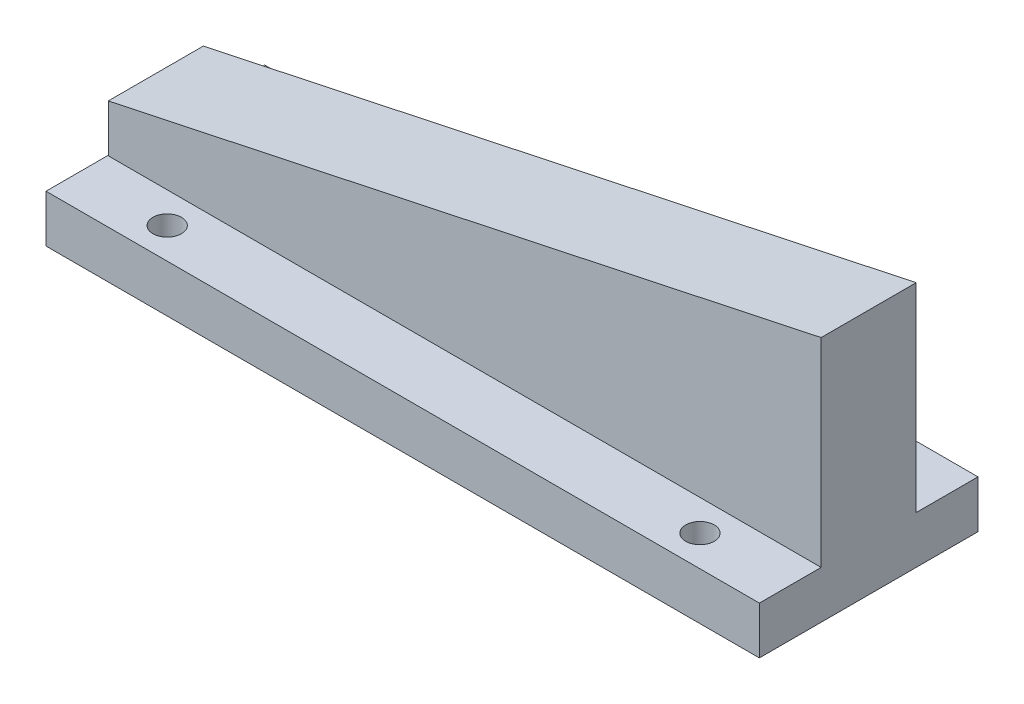
ISO-10303-21;
HEADER;
FILE_DESCRIPTION(('STEP AP214'),'2;1');
FILE_NAME('part.step','',(''),(''),'','','');
FILE_SCHEMA(('AUTOMOTIVE_DESIGN { 1 0 10303 214 1 1 1 1 }'));
ENDSEC;
DATA;
#1=APPLICATION_CONTEXT('core data for automotive mechanical design processes');
#2=APPLICATION_PROTOCOL_DEFINITION('international standard','automotive_design',2000,#1);
#3=PRODUCT_CONTEXT('',#1,'mechanical');
#4=PRODUCT('Part','Part','',(#3));
#5=PRODUCT_RELATED_PRODUCT_CATEGORY('part','',(#4));
#6=PRODUCT_DEFINITION_FORMATION('','',#4);
#7=PRODUCT_DEFINITION_CONTEXT('part definition',#1,'design');
#8=PRODUCT_DEFINITION('design','',#6,#7);
#9=PRODUCT_DEFINITION_SHAPE('','',#8);
#10=(LENGTH_UNIT() NAMED_UNIT(*) SI_UNIT(.MILLI.,.METRE.));
#11=(NAMED_UNIT(*) PLANE_ANGLE_UNIT() SI_UNIT($,.RADIAN.));
#12=(NAMED_UNIT(*) SI_UNIT($,.STERADIAN.) SOLID_ANGLE_UNIT());
#13=UNCERTAINTY_MEASURE_WITH_UNIT(LENGTH_MEASURE(1.E-05),#10,'distance_accuracy_value','');
#14=(GEOMETRIC_REPRESENTATION_CONTEXT(3) GLOBAL_UNCERTAINTY_ASSIGNED_CONTEXT((#13)) GLOBAL_UNIT_ASSIGNED_CONTEXT((#10,
#11,#12)) REPRESENTATION_CONTEXT('',''));
#15=CARTESIAN_POINT('',(0.,0.,0.));
#16=DIRECTION('',(0.,0.,1.));
#17=DIRECTION('',(1.,0.,0.));
#18=AXIS2_PLACEMENT_3D('',#15,#16,#17);
#19=CARTESIAN_POINT('',(-75.,10.,-10.));
#20=DIRECTION('',(0.,0.,1.));
#21=DIRECTION('',(1.,0.,0.));
#22=AXIS2_PLACEMENT_3D('',#19,#20,#21);
#23=PLANE('',#22);
#24=DIRECTION('',(1.,0.,0.));
#25=VECTOR('',#24,1.);
#26=CARTESIAN_POINT('',(-75.,0.,-10.));
#27=LINE('',#26,#25);
#28=CARTESIAN_POINT('',(-75.,0.,-10.));
#29=VERTEX_POINT('',#28);
#30=CARTESIAN_POINT('',(75.,0.,-10.));
#31=VERTEX_POINT('',#30);
#32=EDGE_CURVE('E152',#29,#31,#27,.T.);
#33=ORIENTED_EDGE('',*,*,#32,.F.);
#34=DIRECTION('',(0.,-1.,0.));
#35=VECTOR('',#34,1.);
#36=CARTESIAN_POINT('',(-75.,10.,-10.));
#37=LINE('',#36,#35);
#38=CARTESIAN_POINT('',(-75.,10.,-10.));
#39=VERTEX_POINT('',#38);
#40=EDGE_CURVE('E76',#39,#29,#37,.T.);
#41=ORIENTED_EDGE('',*,*,#40,.F.);
#42=DIRECTION('',(-0.978147600733807,-0.207911690817753,0.));
#43=VECTOR('',#42,1.);
#44=CARTESIAN_POINT('',(75.,41.8834842505023,-10.));
#45=LINE('',#44,#43);
#46=CARTESIAN_POINT('',(75.,41.8834842505023,-10.));
#47=VERTEX_POINT('',#46);
#48=EDGE_CURVE('E160',#47,#39,#45,.T.);
#49=ORIENTED_EDGE('',*,*,#48,.F.);
#50=DIRECTION('',(0.,-1.,0.));
#51=VECTOR('',#50,1.);
#52=CARTESIAN_POINT('',(75.,10.,-10.));
#53=LINE('',#52,#51);
#54=EDGE_CURVE('E61',#47,#31,#53,.T.);
#55=ORIENTED_EDGE('',*,*,#54,.T.);
#56=EDGE_LOOP('',(#33,#41,#49,#55));
#57=FACE_BOUND('',#56,.T.);
#58=ADVANCED_FACE('F52',(#57),#23,.F.);
#59=CARTESIAN_POINT('',(-75.,10.,10.));
#60=DIRECTION('',(1.,0.,0.));
#61=DIRECTION('',(0.,0.,-1.));
#62=AXIS2_PLACEMENT_3D('',#59,#60,#61);
#63=PLANE('',#62);
#64=DIRECTION('',(0.,0.,-1.));
#65=VECTOR('',#64,1.);
#66=CARTESIAN_POINT('',(-75.,0.,10.));
#67=LINE('',#66,#65);
#68=CARTESIAN_POINT('',(-75.,0.,10.));
#69=VERTEX_POINT('',#68);
#70=EDGE_CURVE('E148',#69,#29,#67,.T.);
#71=ORIENTED_EDGE('',*,*,#70,.F.);
#72=DIRECTION('',(0.,-1.,0.));
#73=VECTOR('',#72,1.);
#74=CARTESIAN_POINT('',(-75.,10.,10.));
#75=LINE('',#74,#73);
#76=CARTESIAN_POINT('',(-75.,10.,10.));
#77=VERTEX_POINT('',#76);
#78=EDGE_CURVE('E68',#77,#69,#75,.T.);
#79=ORIENTED_EDGE('',*,*,#78,.F.);
#80=DIRECTION('',(0.,0.,1.));
#81=VECTOR('',#80,1.);
#82=CARTESIAN_POINT('',(-75.,10.,10.));
#83=LINE('',#82,#81);
#84=EDGE_CURVE('E172',#39,#77,#83,.T.);
#85=ORIENTED_EDGE('',*,*,#84,.F.);
#86=ORIENTED_EDGE('',*,*,#40,.T.);
#87=EDGE_LOOP('',(#71,#79,#85,#86));
#88=FACE_BOUND('',#87,.T.);
#89=ADVANCED_FACE('F274',(#88),#63,.F.);
#90=CARTESIAN_POINT('',(-75.,10.,10.));
#91=DIRECTION('',(0.,0.,-1.));
#92=DIRECTION('',(-1.,0.,0.));
#93=AXIS2_PLACEMENT_3D('',#90,#91,#92);
#94=PLANE('',#93);
#95=DIRECTION('',(-1.,0.,0.));
#96=VECTOR('',#95,1.);
#97=CARTESIAN_POINT('',(-75.,0.,10.));
#98=LINE('',#97,#96);
#99=CARTESIAN_POINT('',(75.,0.,10.));
#100=VERTEX_POINT('',#99);
#101=EDGE_CURVE('E12',#100,#69,#98,.T.);
#102=ORIENTED_EDGE('',*,*,#101,.F.);
#103=DIRECTION('',(0.,-1.,0.));
#104=VECTOR('',#103,1.);
#105=CARTESIAN_POINT('',(75.,10.,10.));
#106=LINE('',#105,#104);
#107=CARTESIAN_POINT('',(75.,41.8834842505023,10.));
#108=VERTEX_POINT('',#107);
#109=EDGE_CURVE('E176',#108,#100,#106,.T.);
#110=ORIENTED_EDGE('',*,*,#109,.F.);
#111=DIRECTION('',(-0.978147600733807,-0.207911690817753,0.));
#112=VECTOR('',#111,1.);
#113=CARTESIAN_POINT('',(75.,41.8834842505023,10.));
#114=LINE('',#113,#112);
#115=EDGE_CURVE('E161',#108,#77,#114,.T.);
#116=ORIENTED_EDGE('',*,*,#115,.T.);
#117=ORIENTED_EDGE('',*,*,#78,.T.);
#118=EDGE_LOOP('',(#102,#110,#116,#117));
#119=FACE_BOUND('',#118,.T.);
#120=ADVANCED_FACE('F197',(#119),#94,.F.);
#121=CARTESIAN_POINT('',(75.,10.,10.));
#122=DIRECTION('',(-1.,0.,0.));
#123=DIRECTION('',(0.,0.,1.));
#124=AXIS2_PLACEMENT_3D('',#121,#122,#123);
#125=PLANE('',#124);
#126=DIRECTION('',(0.,0.,-1.));
#127=VECTOR('',#126,1.);
#128=CARTESIAN_POINT('',(75.,-10.,10.));
#129=LINE('',#128,#127);
#130=CARTESIAN_POINT('',(75.,-10.,23.));
#131=VERTEX_POINT('',#130);
#132=CARTESIAN_POINT('',(75.,-10.,-23.));
#133=VERTEX_POINT('',#132);
#134=EDGE_CURVE('E171',#131,#133,#129,.T.);
#135=ORIENTED_EDGE('',*,*,#134,.T.);
#136=DIRECTION('',(0.,1.,0.));
#137=VECTOR('',#136,1.);
#138=CARTESIAN_POINT('',(75.,0.,-23.));
#139=LINE('',#138,#137);
#140=CARTESIAN_POINT('',(75.,0.,-23.));
#141=VERTEX_POINT('',#140);
#142=EDGE_CURVE('E142',#133,#141,#139,.T.);
#143=ORIENTED_EDGE('',*,*,#142,.T.);
#144=DIRECTION('',(0.,0.,-1.));
#145=VECTOR('',#144,1.);
#146=CARTESIAN_POINT('',(75.,0.,23.));
#147=LINE('',#146,#145);
#148=EDGE_CURVE('E192',#31,#141,#147,.T.);
#149=ORIENTED_EDGE('',*,*,#148,.F.);
#150=ORIENTED_EDGE('',*,*,#54,.F.);
#151=DIRECTION('',(0.,0.,-1.));
#152=VECTOR('',#151,1.);
#153=CARTESIAN_POINT('',(75.,41.8834842505023,10.));
#154=LINE('',#153,#152);
#155=EDGE_CURVE('E164',#108,#47,#154,.T.);
#156=ORIENTED_EDGE('',*,*,#155,.F.);
#157=ORIENTED_EDGE('',*,*,#109,.T.);
#158=CARTESIAN_POINT('',(75.,0.,23.));
#159=VERTEX_POINT('',#158);
#160=EDGE_CURVE('E154',#159,#100,#147,.T.);
#161=ORIENTED_EDGE('',*,*,#160,.F.);
#162=DIRECTION('',(0.,1.,0.));
#163=VECTOR('',#162,1.);
#164=CARTESIAN_POINT('',(75.,0.,23.));
#165=LINE('',#164,#163);
#166=EDGE_CURVE('E138',#131,#159,#165,.T.);
#167=ORIENTED_EDGE('',*,*,#166,.F.);
#168=EDGE_LOOP('',(#135,#143,#149,#150,#156,#157,#161,#167));
#169=FACE_BOUND('',#168,.T.);
#170=ADVANCED_FACE('F54',(#169),#125,.F.);
#171=CARTESIAN_POINT('',(0.,-10.,0.));
#172=DIRECTION('',(0.,-1.,0.));
#173=DIRECTION('',(0.,0.,-1.));
#174=AXIS2_PLACEMENT_3D('',#171,#172,#173);
#175=PLANE('',#174);
#176=CARTESIAN_POINT('',(-56.0999308910491,-10.,16.5));
#177=DIRECTION('',(0.,-1.,0.));
#178=DIRECTION('',(0.,0.,-1.));
#179=AXIS2_PLACEMENT_3D('',#176,#177,#178);
#180=CIRCLE('',#179,3.00000000000001);
#181=CARTESIAN_POINT('',(-56.0999308910491,-10.,13.5));
#182=VERTEX_POINT('',#181);
#183=EDGE_CURVE('E212',#182,#182,#180,.T.);
#184=ORIENTED_EDGE('',*,*,#183,.F.);
#185=EDGE_LOOP('',(#184));
#186=FACE_BOUND('',#185,.T.);
#187=CARTESIAN_POINT('',(56.,-10.,16.5));
#188=DIRECTION('',(0.,-1.,0.));
#189=DIRECTION('',(0.,0.,-1.));
#190=AXIS2_PLACEMENT_3D('',#187,#188,#189);
#191=CIRCLE('',#190,3.00000000000001);
#192=CARTESIAN_POINT('',(56.,-10.,13.5));
#193=VERTEX_POINT('',#192);
#194=EDGE_CURVE('E220',#193,#193,#191,.T.);
#195=ORIENTED_EDGE('',*,*,#194,.F.);
#196=EDGE_LOOP('',(#195));
#197=FACE_BOUND('',#196,.T.);
#198=CARTESIAN_POINT('',(56.,-10.,-16.5));
#199=DIRECTION('',(0.,-1.,0.));
#200=DIRECTION('',(0.,0.,-1.));
#201=AXIS2_PLACEMENT_3D('',#198,#199,#200);
#202=CIRCLE('',#201,3.00000000000001);
#203=CARTESIAN_POINT('',(56.,-10.,-19.5));
#204=VERTEX_POINT('',#203);
#205=EDGE_CURVE('E224',#204,#204,#202,.T.);
#206=ORIENTED_EDGE('',*,*,#205,.F.);
#207=EDGE_LOOP('',(#206));
#208=FACE_BOUND('',#207,.T.);
#209=CARTESIAN_POINT('',(-56.0999308910491,-10.,-16.5));
#210=DIRECTION('',(0.,-1.,0.));
#211=DIRECTION('',(0.,0.,-1.));
#212=AXIS2_PLACEMENT_3D('',#209,#210,#211);
#213=CIRCLE('',#212,3.00000000000001);
#214=CARTESIAN_POINT('',(-56.0999308910491,-10.,-19.5));
#215=VERTEX_POINT('',#214);
#216=EDGE_CURVE('E228',#215,#215,#213,.T.);
#217=ORIENTED_EDGE('',*,*,#216,.F.);
#218=EDGE_LOOP('',(#217));
#219=FACE_BOUND('',#218,.T.);
#220=ORIENTED_EDGE('',*,*,#134,.F.);
#221=DIRECTION('',(1.,0.,0.));
#222=VECTOR('',#221,1.);
#223=CARTESIAN_POINT('',(75.,-10.,23.));
#224=LINE('',#223,#222);
#225=CARTESIAN_POINT('',(-75.0999308910491,-10.,23.));
#226=VERTEX_POINT('',#225);
#227=EDGE_CURVE('E132',#226,#131,#224,.T.);
#228=ORIENTED_EDGE('',*,*,#227,.F.);
#229=DIRECTION('',(0.,0.,-1.));
#230=VECTOR('',#229,1.);
#231=CARTESIAN_POINT('',(-75.0999308910491,-10.,23.));
#232=LINE('',#231,#230);
#233=CARTESIAN_POINT('',(-75.0999308910491,-10.,-23.));
#234=VERTEX_POINT('',#233);
#235=EDGE_CURVE('E127',#226,#234,#232,.T.);
#236=ORIENTED_EDGE('',*,*,#235,.T.);
#237=DIRECTION('',(1.,0.,0.));
#238=VECTOR('',#237,1.);
#239=CARTESIAN_POINT('',(75.,-10.,-23.));
#240=LINE('',#239,#238);
#241=EDGE_CURVE('E203',#234,#133,#240,.T.);
#242=ORIENTED_EDGE('',*,*,#241,.T.);
#243=EDGE_LOOP('',(#220,#228,#236,#242));
#244=FACE_BOUND('',#243,.T.);
#245=ADVANCED_FACE('F282',(#186,#197,#208,#219,#244),#175,.T.);
#246=CARTESIAN_POINT('',(75.,41.8834842505023,10.));
#247=DIRECTION('',(0.207911690817753,-0.978147600733807,0.));
#248=DIRECTION('',(0.978147600733807,0.207911690817753,0.));
#249=AXIS2_PLACEMENT_3D('',#246,#247,#248);
#250=PLANE('',#249);
#251=ORIENTED_EDGE('',*,*,#48,.T.);
#252=ORIENTED_EDGE('',*,*,#84,.T.);
#253=ORIENTED_EDGE('',*,*,#115,.F.);
#254=ORIENTED_EDGE('',*,*,#155,.T.);
#255=EDGE_LOOP('',(#251,#252,#253,#254));
#256=FACE_BOUND('',#255,.T.);
#257=ADVANCED_FACE('F194',(#256),#250,.F.);
#258=CARTESIAN_POINT('',(75.,0.,23.));
#259=DIRECTION('',(0.,-1.,0.));
#260=DIRECTION('',(1.,0.,0.));
#261=AXIS2_PLACEMENT_3D('',#258,#259,#260);
#262=PLANE('',#261);
#263=CARTESIAN_POINT('',(-56.0999308910491,0.,16.5));
#264=DIRECTION('',(0.,1.,0.));
#265=DIRECTION('',(-1.,0.,0.));
#266=AXIS2_PLACEMENT_3D('',#263,#264,#265);
#267=CIRCLE('',#266,3.00000000000001);
#268=CARTESIAN_POINT('',(-59.0999308910491,0.,16.5));
#269=VERTEX_POINT('',#268);
#270=EDGE_CURVE('E237',#269,#269,#267,.T.);
#271=ORIENTED_EDGE('',*,*,#270,.F.);
#272=EDGE_LOOP('',(#271));
#273=FACE_BOUND('',#272,.T.);
#274=CARTESIAN_POINT('',(56.,0.,16.5));
#275=DIRECTION('',(0.,1.,0.));
#276=DIRECTION('',(-1.,0.,0.));
#277=AXIS2_PLACEMENT_3D('',#274,#275,#276);
#278=CIRCLE('',#277,3.00000000000001);
#279=CARTESIAN_POINT('',(53.,0.,16.5));
#280=VERTEX_POINT('',#279);
#281=EDGE_CURVE('E241',#280,#280,#278,.T.);
#282=ORIENTED_EDGE('',*,*,#281,.F.);
#283=EDGE_LOOP('',(#282));
#284=FACE_BOUND('',#283,.T.);
#285=CARTESIAN_POINT('',(56.,0.,-16.5));
#286=DIRECTION('',(0.,1.,0.));
#287=DIRECTION('',(-1.,0.,0.));
#288=AXIS2_PLACEMENT_3D('',#285,#286,#287);
#289=CIRCLE('',#288,3.00000000000001);
#290=CARTESIAN_POINT('',(53.,0.,-16.5));
#291=VERTEX_POINT('',#290);
#292=EDGE_CURVE('E236',#291,#291,#289,.T.);
#293=ORIENTED_EDGE('',*,*,#292,.F.);
#294=EDGE_LOOP('',(#293));
#295=FACE_BOUND('',#294,.T.);
#296=CARTESIAN_POINT('',(-56.0999308910491,0.,-16.5));
#297=DIRECTION('',(0.,1.,0.));
#298=DIRECTION('',(-1.,0.,0.));
#299=AXIS2_PLACEMENT_3D('',#296,#297,#298);
#300=CIRCLE('',#299,3.00000000000001);
#301=CARTESIAN_POINT('',(-59.0999308910491,0.,-16.5));
#302=VERTEX_POINT('',#301);
#303=EDGE_CURVE('E232',#302,#302,#300,.T.);
#304=ORIENTED_EDGE('',*,*,#303,.F.);
#305=EDGE_LOOP('',(#304));
#306=FACE_BOUND('',#305,.T.);
#307=ORIENTED_EDGE('',*,*,#70,.T.);
#308=ORIENTED_EDGE('',*,*,#32,.T.);
#309=ORIENTED_EDGE('',*,*,#148,.T.);
#310=DIRECTION('',(-1.,0.,0.));
#311=VECTOR('',#310,1.);
#312=CARTESIAN_POINT('',(75.,0.,-23.));
#313=LINE('',#312,#311);
#314=CARTESIAN_POINT('',(-75.0999308910491,0.,-23.));
#315=VERTEX_POINT('',#314);
#316=EDGE_CURVE('E146',#141,#315,#313,.T.);
#317=ORIENTED_EDGE('',*,*,#316,.T.);
#318=DIRECTION('',(0.,0.,-1.));
#319=VECTOR('',#318,1.);
#320=CARTESIAN_POINT('',(-75.0999308910491,0.,23.));
#321=LINE('',#320,#319);
#322=CARTESIAN_POINT('',(-75.0999308910491,0.,23.));
#323=VERTEX_POINT('',#322);
#324=EDGE_CURVE('E124',#323,#315,#321,.T.);
#325=ORIENTED_EDGE('',*,*,#324,.F.);
#326=DIRECTION('',(-1.,0.,0.));
#327=VECTOR('',#326,1.);
#328=CARTESIAN_POINT('',(75.,0.,23.));
#329=LINE('',#328,#327);
#330=EDGE_CURVE('E133',#159,#323,#329,.T.);
#331=ORIENTED_EDGE('',*,*,#330,.F.);
#332=ORIENTED_EDGE('',*,*,#160,.T.);
#333=ORIENTED_EDGE('',*,*,#101,.T.);
#334=EDGE_LOOP('',(#307,#308,#309,#317,#325,#331,#332,#333));
#335=FACE_BOUND('',#334,.T.);
#336=ADVANCED_FACE('F144',(#273,#284,#295,#306,#335),#262,.F.);
#337=CARTESIAN_POINT('',(-75.0999308910491,0.,23.));
#338=DIRECTION('',(1.,0.,0.));
#339=DIRECTION('',(0.,0.,-1.));
#340=AXIS2_PLACEMENT_3D('',#337,#338,#339);
#341=PLANE('',#340);
#342=DIRECTION('',(0.,-1.,0.));
#343=VECTOR('',#342,1.);
#344=CARTESIAN_POINT('',(-75.0999308910491,0.,-23.));
#345=LINE('',#344,#343);
#346=EDGE_CURVE('E207',#315,#234,#345,.T.);
#347=ORIENTED_EDGE('',*,*,#346,.T.);
#348=ORIENTED_EDGE('',*,*,#235,.F.);
#349=DIRECTION('',(0.,-1.,0.));
#350=VECTOR('',#349,1.);
#351=CARTESIAN_POINT('',(-75.0999308910491,0.,23.));
#352=LINE('',#351,#350);
#353=EDGE_CURVE('E120',#323,#226,#352,.T.);
#354=ORIENTED_EDGE('',*,*,#353,.F.);
#355=ORIENTED_EDGE('',*,*,#324,.T.);
#356=EDGE_LOOP('',(#347,#348,#354,#355));
#357=FACE_BOUND('',#356,.T.);
#358=ADVANCED_FACE('F122',(#357),#341,.F.);
#359=CARTESIAN_POINT('',(0.,0.,23.));
#360=DIRECTION('',(0.,0.,1.));
#361=DIRECTION('',(1.,0.,0.));
#362=AXIS2_PLACEMENT_3D('',#359,#360,#361);
#363=PLANE('',#362);
#364=ORIENTED_EDGE('',*,*,#330,.T.);
#365=ORIENTED_EDGE('',*,*,#353,.T.);
#366=ORIENTED_EDGE('',*,*,#227,.T.);
#367=ORIENTED_EDGE('',*,*,#166,.T.);
#368=EDGE_LOOP('',(#364,#365,#366,#367));
#369=FACE_BOUND('',#368,.T.);
#370=ADVANCED_FACE('F136',(#369),#363,.T.);
#371=CARTESIAN_POINT('',(0.,0.,-23.));
#372=DIRECTION('',(0.,0.,1.));
#373=DIRECTION('',(1.,0.,0.));
#374=AXIS2_PLACEMENT_3D('',#371,#372,#373);
#375=PLANE('',#374);
#376=ORIENTED_EDGE('',*,*,#316,.F.);
#377=ORIENTED_EDGE('',*,*,#142,.F.);
#378=ORIENTED_EDGE('',*,*,#241,.F.);
#379=ORIENTED_EDGE('',*,*,#346,.F.);
#380=EDGE_LOOP('',(#376,#377,#378,#379));
#381=FACE_BOUND('',#380,.T.);
#382=ADVANCED_FACE('F259',(#381),#375,.F.);
#383=CARTESIAN_POINT('',(-56.0999308910491,-46.,-16.5));
#384=DIRECTION('',(0.,1.,0.));
#385=DIRECTION('',(-1.,0.,0.));
#386=AXIS2_PLACEMENT_3D('',#383,#384,#385);
#387=CYLINDRICAL_SURFACE('',#386,3.00000000000001);
#388=ORIENTED_EDGE('',*,*,#216,.T.);
#389=EDGE_LOOP('',(#388));
#390=FACE_BOUND('',#389,.T.);
#391=ORIENTED_EDGE('',*,*,#303,.T.);
#392=EDGE_LOOP('',(#391));
#393=FACE_BOUND('',#392,.T.);
#394=ADVANCED_FACE('F257',(#390,#393),#387,.F.);
#395=CARTESIAN_POINT('',(56.,-46.,-16.5));
#396=DIRECTION('',(0.,1.,0.));
#397=DIRECTION('',(-1.,0.,0.));
#398=AXIS2_PLACEMENT_3D('',#395,#396,#397);
#399=CYLINDRICAL_SURFACE('',#398,3.00000000000001);
#400=ORIENTED_EDGE('',*,*,#205,.T.);
#401=EDGE_LOOP('',(#400));
#402=FACE_BOUND('',#401,.T.);
#403=ORIENTED_EDGE('',*,*,#292,.T.);
#404=EDGE_LOOP('',(#403));
#405=FACE_BOUND('',#404,.T.);
#406=ADVANCED_FACE('F249',(#402,#405),#399,.F.);
#407=CARTESIAN_POINT('',(56.,-46.,16.5));
#408=DIRECTION('',(0.,1.,0.));
#409=DIRECTION('',(-1.,0.,0.));
#410=AXIS2_PLACEMENT_3D('',#407,#408,#409);
#411=CYLINDRICAL_SURFACE('',#410,3.00000000000001);
#412=ORIENTED_EDGE('',*,*,#194,.T.);
#413=EDGE_LOOP('',(#412));
#414=FACE_BOUND('',#413,.T.);
#415=ORIENTED_EDGE('',*,*,#281,.T.);
#416=EDGE_LOOP('',(#415));
#417=FACE_BOUND('',#416,.T.);
#418=ADVANCED_FACE('F266',(#414,#417),#411,.F.);
#419=CARTESIAN_POINT('',(-56.0999308910491,-46.,16.5));
#420=DIRECTION('',(0.,1.,0.));
#421=DIRECTION('',(-1.,0.,0.));
#422=AXIS2_PLACEMENT_3D('',#419,#420,#421);
#423=CYLINDRICAL_SURFACE('',#422,3.00000000000001);
#424=ORIENTED_EDGE('',*,*,#183,.T.);
#425=EDGE_LOOP('',(#424));
#426=FACE_BOUND('',#425,.T.);
#427=ORIENTED_EDGE('',*,*,#270,.T.);
#428=EDGE_LOOP('',(#427));
#429=FACE_BOUND('',#428,.T.);
#430=ADVANCED_FACE('F337',(#426,#429),#423,.F.);
#431=CLOSED_SHELL('',(#58,#89,#120,#170,#245,#257,#336,#358,#370,#382,#394,#406,#418,#430));
#432=MANIFOLD_SOLID_BREP('B2',#431);
#433=ADVANCED_BREP_SHAPE_REPRESENTATION('',(#18,#432),#14);
#434=SHAPE_DEFINITION_REPRESENTATION(#9,#433);
ENDSEC;
END-ISO-10303-21;
